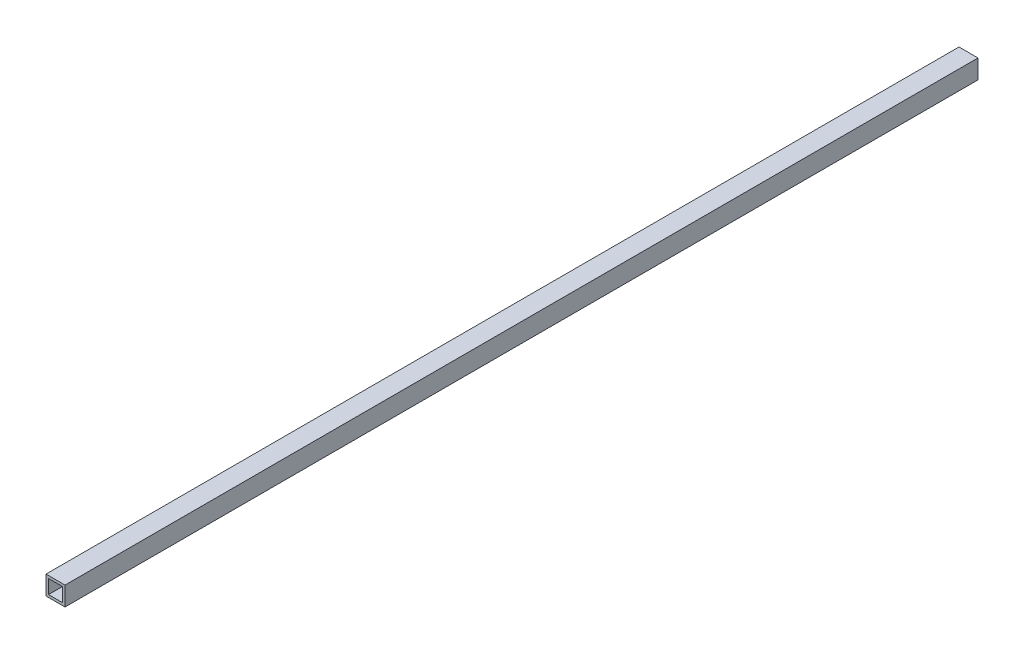
ISO-10303-21;
HEADER;
FILE_DESCRIPTION(('STEP AP214'),'2;1');
FILE_NAME('part.step','',(''),(''),'','','');
FILE_SCHEMA(('AUTOMOTIVE_DESIGN { 1 0 10303 214 1 1 1 1 }'));
ENDSEC;
DATA;
#1=APPLICATION_CONTEXT('core data for automotive mechanical design processes');
#2=APPLICATION_PROTOCOL_DEFINITION('international standard','automotive_design',2000,#1);
#3=PRODUCT_CONTEXT('',#1,'mechanical');
#4=PRODUCT('Part','Part','',(#3));
#5=PRODUCT_RELATED_PRODUCT_CATEGORY('part','',(#4));
#6=PRODUCT_DEFINITION_FORMATION('','',#4);
#7=PRODUCT_DEFINITION_CONTEXT('part definition',#1,'design');
#8=PRODUCT_DEFINITION('design','',#6,#7);
#9=PRODUCT_DEFINITION_SHAPE('','',#8);
#10=(LENGTH_UNIT() NAMED_UNIT(*) SI_UNIT(.MILLI.,.METRE.));
#11=(NAMED_UNIT(*) PLANE_ANGLE_UNIT() SI_UNIT($,.RADIAN.));
#12=(NAMED_UNIT(*) SI_UNIT($,.STERADIAN.) SOLID_ANGLE_UNIT());
#13=UNCERTAINTY_MEASURE_WITH_UNIT(LENGTH_MEASURE(1.E-05),#10,'distance_accuracy_value','');
#14=(GEOMETRIC_REPRESENTATION_CONTEXT(3) GLOBAL_UNCERTAINTY_ASSIGNED_CONTEXT((#13)) GLOBAL_UNIT_ASSIGNED_CONTEXT((#10,
#11,#12)) REPRESENTATION_CONTEXT('',''));
#15=CARTESIAN_POINT('',(0.,0.,0.));
#16=DIRECTION('',(0.,0.,1.));
#17=DIRECTION('',(1.,0.,0.));
#18=AXIS2_PLACEMENT_3D('',#15,#16,#17);
#19=CARTESIAN_POINT('',(0.,0.,304.8));
#20=DIRECTION('',(0.,0.,1.));
#21=DIRECTION('',(1.,0.,0.));
#22=AXIS2_PLACEMENT_3D('',#19,#20,#21);
#23=PLANE('',#22);
#24=DIRECTION('',(0.,1.,0.));
#25=VECTOR('',#24,1.);
#26=CARTESIAN_POINT('',(6.35,6.35,304.8));
#27=LINE('',#26,#25);
#28=CARTESIAN_POINT('',(6.35,-6.35,304.8));
#29=VERTEX_POINT('',#28);
#30=CARTESIAN_POINT('',(6.35,6.35,304.8));
#31=VERTEX_POINT('',#30);
#32=EDGE_CURVE('E133',#29,#31,#27,.T.);
#33=ORIENTED_EDGE('',*,*,#32,.T.);
#34=DIRECTION('',(-1.,0.,0.));
#35=VECTOR('',#34,1.);
#36=CARTESIAN_POINT('',(-6.35,6.35,304.8));
#37=LINE('',#36,#35);
#38=CARTESIAN_POINT('',(-6.35,6.35,304.8));
#39=VERTEX_POINT('',#38);
#40=EDGE_CURVE('E136',#31,#39,#37,.T.);
#41=ORIENTED_EDGE('',*,*,#40,.T.);
#42=DIRECTION('',(0.,-1.,0.));
#43=VECTOR('',#42,1.);
#44=CARTESIAN_POINT('',(-6.35,6.35,304.8));
#45=LINE('',#44,#43);
#46=CARTESIAN_POINT('',(-6.35,-6.35,304.8));
#47=VERTEX_POINT('',#46);
#48=EDGE_CURVE('E139',#39,#47,#45,.T.);
#49=ORIENTED_EDGE('',*,*,#48,.T.);
#50=DIRECTION('',(1.,0.,0.));
#51=VECTOR('',#50,1.);
#52=CARTESIAN_POINT('',(-6.35,-6.35,304.8));
#53=LINE('',#52,#51);
#54=EDGE_CURVE('E141',#47,#29,#53,.T.);
#55=ORIENTED_EDGE('',*,*,#54,.T.);
#56=EDGE_LOOP('',(#33,#41,#49,#55));
#57=FACE_BOUND('',#56,.T.);
#58=DIRECTION('',(1.,0.,0.));
#59=VECTOR('',#58,1.);
#60=CARTESIAN_POINT('',(-4.65,-4.65,304.8));
#61=LINE('',#60,#59);
#62=CARTESIAN_POINT('',(-4.65,-4.65,304.8));
#63=VERTEX_POINT('',#62);
#64=CARTESIAN_POINT('',(4.65,-4.65,304.8));
#65=VERTEX_POINT('',#64);
#66=EDGE_CURVE('E105',#63,#65,#61,.T.);
#67=ORIENTED_EDGE('',*,*,#66,.F.);
#68=DIRECTION('',(0.,-1.,0.));
#69=VECTOR('',#68,1.);
#70=CARTESIAN_POINT('',(-4.65,4.65,304.8));
#71=LINE('',#70,#69);
#72=CARTESIAN_POINT('',(-4.65,4.65,304.8));
#73=VERTEX_POINT('',#72);
#74=EDGE_CURVE('E97',#73,#63,#71,.T.);
#75=ORIENTED_EDGE('',*,*,#74,.F.);
#76=DIRECTION('',(-1.,0.,0.));
#77=VECTOR('',#76,1.);
#78=CARTESIAN_POINT('',(-4.65,4.65,304.8));
#79=LINE('',#78,#77);
#80=CARTESIAN_POINT('',(4.65,4.65,304.8));
#81=VERTEX_POINT('',#80);
#82=EDGE_CURVE('E119',#81,#73,#79,.T.);
#83=ORIENTED_EDGE('',*,*,#82,.F.);
#84=DIRECTION('',(0.,1.,0.));
#85=VECTOR('',#84,1.);
#86=CARTESIAN_POINT('',(4.65,4.65,304.8));
#87=LINE('',#86,#85);
#88=EDGE_CURVE('E117',#65,#81,#87,.T.);
#89=ORIENTED_EDGE('',*,*,#88,.F.);
#90=EDGE_LOOP('',(#67,#75,#83,#89));
#91=FACE_BOUND('',#90,.T.);
#92=ADVANCED_FACE('F32',(#57,#91),#23,.T.);
#93=CARTESIAN_POINT('',(0.,0.,-304.8));
#94=DIRECTION('',(0.,0.,1.));
#95=DIRECTION('',(1.,0.,0.));
#96=AXIS2_PLACEMENT_3D('',#93,#94,#95);
#97=PLANE('',#96);
#98=DIRECTION('',(0.,1.,0.));
#99=VECTOR('',#98,1.);
#100=CARTESIAN_POINT('',(6.35,6.35,-304.8));
#101=LINE('',#100,#99);
#102=CARTESIAN_POINT('',(6.35,-6.35,-304.8));
#103=VERTEX_POINT('',#102);
#104=CARTESIAN_POINT('',(6.35,6.35,-304.8));
#105=VERTEX_POINT('',#104);
#106=EDGE_CURVE('E113',#103,#105,#101,.T.);
#107=ORIENTED_EDGE('',*,*,#106,.F.);
#108=DIRECTION('',(1.,0.,0.));
#109=VECTOR('',#108,1.);
#110=CARTESIAN_POINT('',(-6.35,-6.35,-304.8));
#111=LINE('',#110,#109);
#112=CARTESIAN_POINT('',(-6.35,-6.35,-304.8));
#113=VERTEX_POINT('',#112);
#114=EDGE_CURVE('E137',#113,#103,#111,.T.);
#115=ORIENTED_EDGE('',*,*,#114,.F.);
#116=DIRECTION('',(0.,-1.,0.));
#117=VECTOR('',#116,1.);
#118=CARTESIAN_POINT('',(-6.35,6.35,-304.8));
#119=LINE('',#118,#117);
#120=CARTESIAN_POINT('',(-6.35,6.35,-304.8));
#121=VERTEX_POINT('',#120);
#122=EDGE_CURVE('E148',#121,#113,#119,.T.);
#123=ORIENTED_EDGE('',*,*,#122,.F.);
#124=DIRECTION('',(-1.,0.,0.));
#125=VECTOR('',#124,1.);
#126=CARTESIAN_POINT('',(-6.35,6.35,-304.8));
#127=LINE('',#126,#125);
#128=EDGE_CURVE('E146',#105,#121,#127,.T.);
#129=ORIENTED_EDGE('',*,*,#128,.F.);
#130=EDGE_LOOP('',(#107,#115,#123,#129));
#131=FACE_BOUND('',#130,.T.);
#132=DIRECTION('',(0.,-1.,0.));
#133=VECTOR('',#132,1.);
#134=CARTESIAN_POINT('',(-4.65,4.65,-304.8));
#135=LINE('',#134,#133);
#136=CARTESIAN_POINT('',(-4.65,4.65,-304.8));
#137=VERTEX_POINT('',#136);
#138=CARTESIAN_POINT('',(-4.65,-4.65,-304.8));
#139=VERTEX_POINT('',#138);
#140=EDGE_CURVE('E55',#137,#139,#135,.T.);
#141=ORIENTED_EDGE('',*,*,#140,.T.);
#142=DIRECTION('',(1.,0.,0.));
#143=VECTOR('',#142,1.);
#144=CARTESIAN_POINT('',(-4.65,-4.65,-304.8));
#145=LINE('',#144,#143);
#146=CARTESIAN_POINT('',(4.65,-4.65,-304.8));
#147=VERTEX_POINT('',#146);
#148=EDGE_CURVE('E112',#139,#147,#145,.T.);
#149=ORIENTED_EDGE('',*,*,#148,.T.);
#150=DIRECTION('',(0.,1.,0.));
#151=VECTOR('',#150,1.);
#152=CARTESIAN_POINT('',(4.65,4.65,-304.8));
#153=LINE('',#152,#151);
#154=CARTESIAN_POINT('',(4.65,4.65,-304.8));
#155=VERTEX_POINT('',#154);
#156=EDGE_CURVE('E125',#147,#155,#153,.T.);
#157=ORIENTED_EDGE('',*,*,#156,.T.);
#158=DIRECTION('',(-1.,0.,0.));
#159=VECTOR('',#158,1.);
#160=CARTESIAN_POINT('',(-4.65,4.65,-304.8));
#161=LINE('',#160,#159);
#162=EDGE_CURVE('E106',#155,#137,#161,.T.);
#163=ORIENTED_EDGE('',*,*,#162,.T.);
#164=EDGE_LOOP('',(#141,#149,#157,#163));
#165=FACE_BOUND('',#164,.T.);
#166=ADVANCED_FACE('F166',(#131,#165),#97,.F.);
#167=CARTESIAN_POINT('',(6.35,6.35,304.8));
#168=DIRECTION('',(-1.,0.,0.));
#169=DIRECTION('',(0.,-1.,0.));
#170=AXIS2_PLACEMENT_3D('',#167,#168,#169);
#171=PLANE('',#170);
#172=ORIENTED_EDGE('',*,*,#106,.T.);
#173=DIRECTION('',(0.,0.,-1.));
#174=VECTOR('',#173,1.);
#175=CARTESIAN_POINT('',(6.35,6.35,304.8));
#176=LINE('',#175,#174);
#177=EDGE_CURVE('E11',#31,#105,#176,.T.);
#178=ORIENTED_EDGE('',*,*,#177,.F.);
#179=ORIENTED_EDGE('',*,*,#32,.F.);
#180=DIRECTION('',(0.,0.,-1.));
#181=VECTOR('',#180,1.);
#182=CARTESIAN_POINT('',(6.35,-6.35,304.8));
#183=LINE('',#182,#181);
#184=EDGE_CURVE('E143',#29,#103,#183,.T.);
#185=ORIENTED_EDGE('',*,*,#184,.T.);
#186=EDGE_LOOP('',(#172,#178,#179,#185));
#187=FACE_BOUND('',#186,.T.);
#188=ADVANCED_FACE('F34',(#187),#171,.F.);
#189=CARTESIAN_POINT('',(-6.35,6.35,304.8));
#190=DIRECTION('',(0.,-1.,0.));
#191=DIRECTION('',(0.,0.,-1.));
#192=AXIS2_PLACEMENT_3D('',#189,#190,#191);
#193=PLANE('',#192);
#194=ORIENTED_EDGE('',*,*,#128,.T.);
#195=DIRECTION('',(0.,0.,-1.));
#196=VECTOR('',#195,1.);
#197=CARTESIAN_POINT('',(-6.35,6.35,304.8));
#198=LINE('',#197,#196);
#199=EDGE_CURVE('E40',#39,#121,#198,.T.);
#200=ORIENTED_EDGE('',*,*,#199,.F.);
#201=ORIENTED_EDGE('',*,*,#40,.F.);
#202=ORIENTED_EDGE('',*,*,#177,.T.);
#203=EDGE_LOOP('',(#194,#200,#201,#202));
#204=FACE_BOUND('',#203,.T.);
#205=ADVANCED_FACE('F176',(#204),#193,.F.);
#206=CARTESIAN_POINT('',(-6.35,6.35,304.8));
#207=DIRECTION('',(1.,0.,0.));
#208=DIRECTION('',(0.,1.,0.));
#209=AXIS2_PLACEMENT_3D('',#206,#207,#208);
#210=PLANE('',#209);
#211=ORIENTED_EDGE('',*,*,#122,.T.);
#212=DIRECTION('',(0.,0.,-1.));
#213=VECTOR('',#212,1.);
#214=CARTESIAN_POINT('',(-6.35,-6.35,304.8));
#215=LINE('',#214,#213);
#216=EDGE_CURVE('E153',#47,#113,#215,.T.);
#217=ORIENTED_EDGE('',*,*,#216,.F.);
#218=ORIENTED_EDGE('',*,*,#48,.F.);
#219=ORIENTED_EDGE('',*,*,#199,.T.);
#220=EDGE_LOOP('',(#211,#217,#218,#219));
#221=FACE_BOUND('',#220,.T.);
#222=ADVANCED_FACE('F160',(#221),#210,.F.);
#223=CARTESIAN_POINT('',(-6.35,-6.35,304.8));
#224=DIRECTION('',(0.,1.,0.));
#225=DIRECTION('',(0.,0.,1.));
#226=AXIS2_PLACEMENT_3D('',#223,#224,#225);
#227=PLANE('',#226);
#228=ORIENTED_EDGE('',*,*,#114,.T.);
#229=ORIENTED_EDGE('',*,*,#184,.F.);
#230=ORIENTED_EDGE('',*,*,#54,.F.);
#231=ORIENTED_EDGE('',*,*,#216,.T.);
#232=EDGE_LOOP('',(#228,#229,#230,#231));
#233=FACE_BOUND('',#232,.T.);
#234=ADVANCED_FACE('F170',(#233),#227,.F.);
#235=CARTESIAN_POINT('',(-4.65,4.65,304.8));
#236=DIRECTION('',(1.,0.,0.));
#237=DIRECTION('',(0.,1.,0.));
#238=AXIS2_PLACEMENT_3D('',#235,#236,#237);
#239=PLANE('',#238);
#240=ORIENTED_EDGE('',*,*,#140,.F.);
#241=DIRECTION('',(0.,0.,-1.));
#242=VECTOR('',#241,1.);
#243=CARTESIAN_POINT('',(-4.65,4.65,304.8));
#244=LINE('',#243,#242);
#245=EDGE_CURVE('E101',#73,#137,#244,.T.);
#246=ORIENTED_EDGE('',*,*,#245,.F.);
#247=ORIENTED_EDGE('',*,*,#74,.T.);
#248=DIRECTION('',(0.,0.,-1.));
#249=VECTOR('',#248,1.);
#250=CARTESIAN_POINT('',(-4.65,-4.65,304.8));
#251=LINE('',#250,#249);
#252=EDGE_CURVE('E100',#63,#139,#251,.T.);
#253=ORIENTED_EDGE('',*,*,#252,.T.);
#254=EDGE_LOOP('',(#240,#246,#247,#253));
#255=FACE_BOUND('',#254,.T.);
#256=ADVANCED_FACE('F99',(#255),#239,.T.);
#257=CARTESIAN_POINT('',(-4.65,-4.65,304.8));
#258=DIRECTION('',(0.,1.,0.));
#259=DIRECTION('',(-1.,0.,0.));
#260=AXIS2_PLACEMENT_3D('',#257,#258,#259);
#261=PLANE('',#260);
#262=ORIENTED_EDGE('',*,*,#148,.F.);
#263=ORIENTED_EDGE('',*,*,#252,.F.);
#264=ORIENTED_EDGE('',*,*,#66,.T.);
#265=DIRECTION('',(0.,0.,-1.));
#266=VECTOR('',#265,1.);
#267=CARTESIAN_POINT('',(4.65,-4.65,304.8));
#268=LINE('',#267,#266);
#269=EDGE_CURVE('E114',#65,#147,#268,.T.);
#270=ORIENTED_EDGE('',*,*,#269,.T.);
#271=EDGE_LOOP('',(#262,#263,#264,#270));
#272=FACE_BOUND('',#271,.T.);
#273=ADVANCED_FACE('F109',(#272),#261,.T.);
#274=CARTESIAN_POINT('',(4.65,4.65,304.8));
#275=DIRECTION('',(-1.,0.,0.));
#276=DIRECTION('',(0.,-1.,0.));
#277=AXIS2_PLACEMENT_3D('',#274,#275,#276);
#278=PLANE('',#277);
#279=ORIENTED_EDGE('',*,*,#156,.F.);
#280=ORIENTED_EDGE('',*,*,#269,.F.);
#281=ORIENTED_EDGE('',*,*,#88,.T.);
#282=DIRECTION('',(0.,0.,-1.));
#283=VECTOR('',#282,1.);
#284=CARTESIAN_POINT('',(4.65,4.65,304.8));
#285=LINE('',#284,#283);
#286=EDGE_CURVE('E47',#81,#155,#285,.T.);
#287=ORIENTED_EDGE('',*,*,#286,.T.);
#288=EDGE_LOOP('',(#279,#280,#281,#287));
#289=FACE_BOUND('',#288,.T.);
#290=ADVANCED_FACE('F199',(#289),#278,.T.);
#291=CARTESIAN_POINT('',(-4.65,4.65,304.8));
#292=DIRECTION('',(0.,-1.,0.));
#293=DIRECTION('',(0.,0.,-1.));
#294=AXIS2_PLACEMENT_3D('',#291,#292,#293);
#295=PLANE('',#294);
#296=ORIENTED_EDGE('',*,*,#162,.F.);
#297=ORIENTED_EDGE('',*,*,#286,.F.);
#298=ORIENTED_EDGE('',*,*,#82,.T.);
#299=ORIENTED_EDGE('',*,*,#245,.T.);
#300=EDGE_LOOP('',(#296,#297,#298,#299));
#301=FACE_BOUND('',#300,.T.);
#302=ADVANCED_FACE('F203',(#301),#295,.T.);
#303=CLOSED_SHELL('',(#92,#166,#188,#205,#222,#234,#256,#273,#290,#302));
#304=MANIFOLD_SOLID_BREP('B2',#303);
#305=ADVANCED_BREP_SHAPE_REPRESENTATION('',(#18,#304),#14);
#306=SHAPE_DEFINITION_REPRESENTATION(#9,#305);
ENDSEC;
END-ISO-10303-21;
